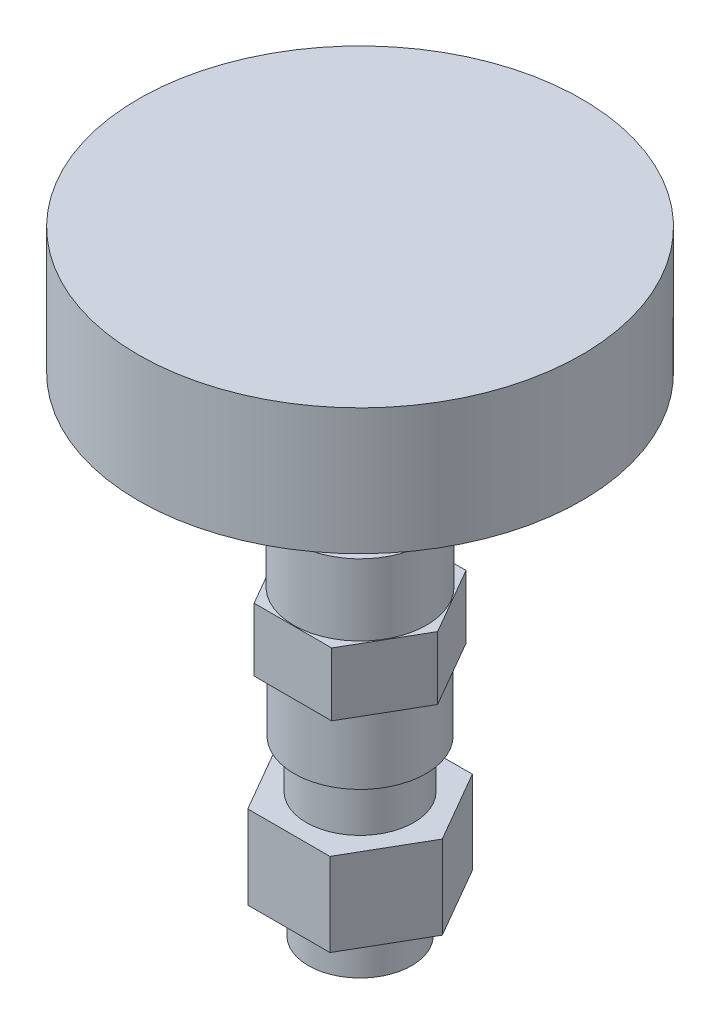
ISO-10303-21;
HEADER;
FILE_DESCRIPTION(('STEP AP214'),'2;1');
FILE_NAME('part.step','',(''),(''),'','','');
FILE_SCHEMA(('AUTOMOTIVE_DESIGN { 1 0 10303 214 1 1 1 1 }'));
ENDSEC;
DATA;
#1=APPLICATION_CONTEXT('core data for automotive mechanical design processes');
#2=APPLICATION_PROTOCOL_DEFINITION('international standard','automotive_design',2000,#1);
#3=PRODUCT_CONTEXT('',#1,'mechanical');
#4=PRODUCT('Part','Part','',(#3));
#5=PRODUCT_RELATED_PRODUCT_CATEGORY('part','',(#4));
#6=PRODUCT_DEFINITION_FORMATION('','',#4);
#7=PRODUCT_DEFINITION_CONTEXT('part definition',#1,'design');
#8=PRODUCT_DEFINITION('design','',#6,#7);
#9=PRODUCT_DEFINITION_SHAPE('','',#8);
#10=(LENGTH_UNIT() NAMED_UNIT(*) SI_UNIT(.MILLI.,.METRE.));
#11=(NAMED_UNIT(*) PLANE_ANGLE_UNIT() SI_UNIT($,.RADIAN.));
#12=(NAMED_UNIT(*) SI_UNIT($,.STERADIAN.) SOLID_ANGLE_UNIT());
#13=UNCERTAINTY_MEASURE_WITH_UNIT(LENGTH_MEASURE(1.E-05),#10,'distance_accuracy_value','');
#14=(GEOMETRIC_REPRESENTATION_CONTEXT(3) GLOBAL_UNCERTAINTY_ASSIGNED_CONTEXT((#13)) GLOBAL_UNIT_ASSIGNED_CONTEXT((#10,
#11,#12)) REPRESENTATION_CONTEXT('',''));
#15=CARTESIAN_POINT('',(0.,0.,0.));
#16=DIRECTION('',(0.,0.,1.));
#17=DIRECTION('',(1.,0.,0.));
#18=AXIS2_PLACEMENT_3D('',#15,#16,#17);
#19=CARTESIAN_POINT('',(0.,35.306,0.));
#20=DIRECTION('',(0.,1.,0.));
#21=DIRECTION('',(0.,0.,1.));
#22=AXIS2_PLACEMENT_3D('',#19,#20,#21);
#23=PLANE('',#22);
#24=CARTESIAN_POINT('',(0.,35.306,0.));
#25=DIRECTION('',(0.,1.,0.));
#26=DIRECTION('',(0.,0.,1.));
#27=AXIS2_PLACEMENT_3D('',#24,#25,#26);
#28=CIRCLE('',#27,6.2865);
#29=CARTESIAN_POINT('',(0.,35.306,6.2865));
#30=VERTEX_POINT('',#29);
#31=EDGE_CURVE('E295',#30,#30,#28,.T.);
#32=ORIENTED_EDGE('',*,*,#31,.T.);
#33=EDGE_LOOP('',(#32));
#34=FACE_BOUND('',#33,.T.);
#35=CARTESIAN_POINT('',(0.,35.306,0.));
#36=DIRECTION('',(0.,1.,0.));
#37=DIRECTION('',(0.,0.,1.));
#38=AXIS2_PLACEMENT_3D('',#35,#36,#37);
#39=CIRCLE('',#38,5.2705);
#40=CARTESIAN_POINT('',(0.,35.306,5.2705));
#41=VERTEX_POINT('',#40);
#42=EDGE_CURVE('E317',#41,#41,#39,.T.);
#43=ORIENTED_EDGE('',*,*,#42,.F.);
#44=EDGE_LOOP('',(#43));
#45=FACE_BOUND('',#44,.T.);
#46=ADVANCED_FACE('F32',(#34,#45),#23,.T.);
#47=CARTESIAN_POINT('',(0.,28.575,0.));
#48=DIRECTION('',(0.,1.,0.));
#49=DIRECTION('',(0.,0.,1.));
#50=AXIS2_PLACEMENT_3D('',#47,#48,#49);
#51=PLANE('',#50);
#52=DIRECTION('',(0.5,0.,-0.866025403784439));
#53=VECTOR('',#52,1.);
#54=CARTESIAN_POINT('',(3.66617420935413,28.575,6.35));
#55=LINE('',#54,#53);
#56=CARTESIAN_POINT('',(3.66617420935413,28.575,6.35));
#57=VERTEX_POINT('',#56);
#58=CARTESIAN_POINT('',(7.33234841870825,28.575,0.));
#59=VERTEX_POINT('',#58);
#60=EDGE_CURVE('E279',#57,#59,#55,.T.);
#61=ORIENTED_EDGE('',*,*,#60,.T.);
#62=DIRECTION('',(-0.5,0.,-0.866025403784439));
#63=VECTOR('',#62,1.);
#64=CARTESIAN_POINT('',(7.33234841870825,28.575,0.));
#65=LINE('',#64,#63);
#66=CARTESIAN_POINT('',(3.66617420935413,28.575,-6.35));
#67=VERTEX_POINT('',#66);
#68=EDGE_CURVE('E307',#59,#67,#65,.T.);
#69=ORIENTED_EDGE('',*,*,#68,.T.);
#70=DIRECTION('',(-1.,0.,0.));
#71=VECTOR('',#70,1.);
#72=CARTESIAN_POINT('',(3.66617420935413,28.575,-6.35));
#73=LINE('',#72,#71);
#74=CARTESIAN_POINT('',(-3.66617420935413,28.575,-6.35));
#75=VERTEX_POINT('',#74);
#76=EDGE_CURVE('E304',#67,#75,#73,.T.);
#77=ORIENTED_EDGE('',*,*,#76,.T.);
#78=DIRECTION('',(-0.5,0.,0.866025403784439));
#79=VECTOR('',#78,1.);
#80=CARTESIAN_POINT('',(-3.66617420935413,28.575,-6.35));
#81=LINE('',#80,#79);
#82=CARTESIAN_POINT('',(-7.33234841870825,28.575,0.));
#83=VERTEX_POINT('',#82);
#84=EDGE_CURVE('E301',#75,#83,#81,.T.);
#85=ORIENTED_EDGE('',*,*,#84,.T.);
#86=DIRECTION('',(0.5,0.,0.866025403784438));
#87=VECTOR('',#86,1.);
#88=CARTESIAN_POINT('',(-7.33234841870825,28.575,0.));
#89=LINE('',#88,#87);
#90=CARTESIAN_POINT('',(-3.66617420935413,28.575,6.35));
#91=VERTEX_POINT('',#90);
#92=EDGE_CURVE('E298',#83,#91,#89,.T.);
#93=ORIENTED_EDGE('',*,*,#92,.T.);
#94=DIRECTION('',(1.,0.,0.));
#95=VECTOR('',#94,1.);
#96=CARTESIAN_POINT('',(-3.66617420935413,28.575,6.35));
#97=LINE('',#96,#95);
#98=EDGE_CURVE('E275',#91,#57,#97,.T.);
#99=ORIENTED_EDGE('',*,*,#98,.T.);
#100=EDGE_LOOP('',(#61,#69,#77,#85,#93,#99));
#101=FACE_BOUND('',#100,.T.);
#102=CARTESIAN_POINT('',(0.,28.575,0.));
#103=DIRECTION('',(0.,1.,0.));
#104=DIRECTION('',(0.,0.,1.));
#105=AXIS2_PLACEMENT_3D('',#102,#103,#104);
#106=CIRCLE('',#105,6.2865);
#107=CARTESIAN_POINT('',(0.,28.575,6.2865));
#108=VERTEX_POINT('',#107);
#109=EDGE_CURVE('E312',#108,#108,#106,.T.);
#110=ORIENTED_EDGE('',*,*,#109,.F.);
#111=EDGE_LOOP('',(#110));
#112=FACE_BOUND('',#111,.T.);
#113=ADVANCED_FACE('F162',(#101,#112),#51,.T.);
#114=CARTESIAN_POINT('',(0.,11.811,0.));
#115=DIRECTION('',(0.,1.,0.));
#116=DIRECTION('',(0.,0.,1.));
#117=AXIS2_PLACEMENT_3D('',#114,#115,#116);
#118=PLANE('',#117);
#119=DIRECTION('',(0.5,0.,-0.866025403784439));
#120=VECTOR('',#119,1.);
#121=CARTESIAN_POINT('',(3.88614466191537,11.811,6.731));
#122=LINE('',#121,#120);
#123=CARTESIAN_POINT('',(3.88614466191537,11.811,6.731));
#124=VERTEX_POINT('',#123);
#125=CARTESIAN_POINT('',(7.77228932383075,11.811,0.));
#126=VERTEX_POINT('',#125);
#127=EDGE_CURVE('E134',#124,#126,#122,.T.);
#128=ORIENTED_EDGE('',*,*,#127,.T.);
#129=DIRECTION('',(-0.5,0.,-0.866025403784438));
#130=VECTOR('',#129,1.);
#131=CARTESIAN_POINT('',(7.77228932383075,11.811,0.));
#132=LINE('',#131,#130);
#133=CARTESIAN_POINT('',(3.88614466191537,11.811,-6.73100000000001));
#134=VERTEX_POINT('',#133);
#135=EDGE_CURVE('E88',#126,#134,#132,.T.);
#136=ORIENTED_EDGE('',*,*,#135,.T.);
#137=DIRECTION('',(-1.,0.,0.));
#138=VECTOR('',#137,1.);
#139=CARTESIAN_POINT('',(3.88614466191537,11.811,-6.73100000000001));
#140=LINE('',#139,#138);
#141=CARTESIAN_POINT('',(-3.88614466191538,11.811,-6.731));
#142=VERTEX_POINT('',#141);
#143=EDGE_CURVE('E105',#134,#142,#140,.T.);
#144=ORIENTED_EDGE('',*,*,#143,.T.);
#145=DIRECTION('',(-0.5,0.,0.866025403784439));
#146=VECTOR('',#145,1.);
#147=CARTESIAN_POINT('',(-3.88614466191538,11.811,-6.731));
#148=LINE('',#147,#146);
#149=CARTESIAN_POINT('',(-7.77228932383075,11.811,0.));
#150=VERTEX_POINT('',#149);
#151=EDGE_CURVE('E98',#142,#150,#148,.T.);
#152=ORIENTED_EDGE('',*,*,#151,.T.);
#153=DIRECTION('',(0.5,0.,0.866025403784438));
#154=VECTOR('',#153,1.);
#155=CARTESIAN_POINT('',(-7.77228932383075,11.811,0.));
#156=LINE('',#155,#154);
#157=CARTESIAN_POINT('',(-3.88614466191537,11.811,6.731));
#158=VERTEX_POINT('',#157);
#159=EDGE_CURVE('E103',#150,#158,#156,.T.);
#160=ORIENTED_EDGE('',*,*,#159,.T.);
#161=DIRECTION('',(1.,0.,0.));
#162=VECTOR('',#161,1.);
#163=CARTESIAN_POINT('',(-3.88614466191537,11.811,6.731));
#164=LINE('',#163,#162);
#165=EDGE_CURVE('E49',#158,#124,#164,.T.);
#166=ORIENTED_EDGE('',*,*,#165,.T.);
#167=EDGE_LOOP('',(#128,#136,#144,#152,#160,#166));
#168=FACE_BOUND('',#167,.T.);
#169=CARTESIAN_POINT('',(0.,11.811,0.));
#170=DIRECTION('',(0.,1.,0.));
#171=DIRECTION('',(0.,0.,1.));
#172=AXIS2_PLACEMENT_3D('',#169,#170,#171);
#173=CIRCLE('',#172,5.08);
#174=CARTESIAN_POINT('',(0.,11.811,5.08));
#175=VERTEX_POINT('',#174);
#176=EDGE_CURVE('E246',#175,#175,#173,.T.);
#177=ORIENTED_EDGE('',*,*,#176,.F.);
#178=EDGE_LOOP('',(#177));
#179=FACE_BOUND('',#178,.T.);
#180=ADVANCED_FACE('F100',(#168,#179),#118,.T.);
#181=CARTESIAN_POINT('',(0.,3.937,0.));
#182=DIRECTION('',(0.,-1.,0.));
#183=DIRECTION('',(0.,0.,-1.));
#184=AXIS2_PLACEMENT_3D('',#181,#182,#183);
#185=CYLINDRICAL_SURFACE('',#184,4.8895);
#186=CARTESIAN_POINT('',(0.,3.937,0.));
#187=DIRECTION('',(0.,1.,0.));
#188=DIRECTION('',(0.,0.,1.));
#189=AXIS2_PLACEMENT_3D('',#186,#187,#188);
#190=CIRCLE('',#189,4.8895);
#191=CARTESIAN_POINT('',(0.,3.937,4.8895));
#192=VERTEX_POINT('',#191);
#193=EDGE_CURVE('E11',#192,#192,#190,.T.);
#194=ORIENTED_EDGE('',*,*,#193,.F.);
#195=EDGE_LOOP('',(#194));
#196=FACE_BOUND('',#195,.T.);
#197=CARTESIAN_POINT('',(0.,0.,0.));
#198=DIRECTION('',(0.,1.,0.));
#199=DIRECTION('',(0.,0.,1.));
#200=AXIS2_PLACEMENT_3D('',#197,#198,#199);
#201=CIRCLE('',#200,4.8895);
#202=CARTESIAN_POINT('',(0.,0.,4.8895));
#203=VERTEX_POINT('',#202);
#204=EDGE_CURVE('E36',#203,#203,#201,.T.);
#205=ORIENTED_EDGE('',*,*,#204,.T.);
#206=EDGE_LOOP('',(#205));
#207=FACE_BOUND('',#206,.T.);
#208=ADVANCED_FACE('F34',(#196,#207),#185,.T.);
#209=CARTESIAN_POINT('',(0.,0.,0.));
#210=DIRECTION('',(0.,1.,0.));
#211=DIRECTION('',(0.,0.,1.));
#212=AXIS2_PLACEMENT_3D('',#209,#210,#211);
#213=PLANE('',#212);
#214=CARTESIAN_POINT('',(0.,0.,0.));
#215=DIRECTION('',(0.,-1.,0.));
#216=DIRECTION('',(0.,0.,-1.));
#217=AXIS2_PLACEMENT_3D('',#214,#215,#216);
#218=CIRCLE('',#217,3.18135);
#219=CARTESIAN_POINT('',(0.,0.,-3.18135));
#220=VERTEX_POINT('',#219);
#221=EDGE_CURVE('E365',#220,#220,#218,.T.);
#222=ORIENTED_EDGE('',*,*,#221,.F.);
#223=EDGE_LOOP('',(#222));
#224=FACE_BOUND('',#223,.T.);
#225=ORIENTED_EDGE('',*,*,#204,.F.);
#226=EDGE_LOOP('',(#225));
#227=FACE_BOUND('',#226,.T.);
#228=ADVANCED_FACE('F147',(#224,#227),#213,.F.);
#229=CARTESIAN_POINT('',(0.,3.937,0.));
#230=DIRECTION('',(0.,1.,0.));
#231=DIRECTION('',(0.,0.,1.));
#232=AXIS2_PLACEMENT_3D('',#229,#230,#231);
#233=PLANE('',#232);
#234=DIRECTION('',(0.5,0.,-0.866025403784439));
#235=VECTOR('',#234,1.);
#236=CARTESIAN_POINT('',(3.88614466191537,3.937,6.731));
#237=LINE('',#236,#235);
#238=CARTESIAN_POINT('',(3.88614466191537,3.937,6.731));
#239=VERTEX_POINT('',#238);
#240=CARTESIAN_POINT('',(7.77228932383075,3.937,0.));
#241=VERTEX_POINT('',#240);
#242=EDGE_CURVE('E123',#239,#241,#237,.T.);
#243=ORIENTED_EDGE('',*,*,#242,.F.);
#244=DIRECTION('',(1.,0.,0.));
#245=VECTOR('',#244,1.);
#246=CARTESIAN_POINT('',(-3.88614466191537,3.937,6.731));
#247=LINE('',#246,#245);
#248=CARTESIAN_POINT('',(-3.88614466191537,3.937,6.731));
#249=VERTEX_POINT('',#248);
#250=EDGE_CURVE('E79',#249,#239,#247,.T.);
#251=ORIENTED_EDGE('',*,*,#250,.F.);
#252=DIRECTION('',(0.5,0.,0.866025403784438));
#253=VECTOR('',#252,1.);
#254=CARTESIAN_POINT('',(-7.77228932383075,3.937,0.));
#255=LINE('',#254,#253);
#256=CARTESIAN_POINT('',(-7.77228932383075,3.937,0.));
#257=VERTEX_POINT('',#256);
#258=EDGE_CURVE('E73',#257,#249,#255,.T.);
#259=ORIENTED_EDGE('',*,*,#258,.F.);
#260=DIRECTION('',(-0.5,0.,0.866025403784439));
#261=VECTOR('',#260,1.);
#262=CARTESIAN_POINT('',(-3.88614466191538,3.937,-6.731));
#263=LINE('',#262,#261);
#264=CARTESIAN_POINT('',(-3.88614466191538,3.937,-6.731));
#265=VERTEX_POINT('',#264);
#266=EDGE_CURVE('E113',#265,#257,#263,.T.);
#267=ORIENTED_EDGE('',*,*,#266,.F.);
#268=DIRECTION('',(-1.,0.,0.));
#269=VECTOR('',#268,1.);
#270=CARTESIAN_POINT('',(3.88614466191537,3.937,-6.73100000000001));
#271=LINE('',#270,#269);
#272=CARTESIAN_POINT('',(3.88614466191537,3.937,-6.73100000000001));
#273=VERTEX_POINT('',#272);
#274=EDGE_CURVE('E129',#273,#265,#271,.T.);
#275=ORIENTED_EDGE('',*,*,#274,.F.);
#276=DIRECTION('',(-0.5,0.,-0.866025403784438));
#277=VECTOR('',#276,1.);
#278=CARTESIAN_POINT('',(7.77228932383075,3.937,0.));
#279=LINE('',#278,#277);
#280=EDGE_CURVE('E126',#241,#273,#279,.T.);
#281=ORIENTED_EDGE('',*,*,#280,.F.);
#282=EDGE_LOOP('',(#243,#251,#259,#267,#275,#281));
#283=FACE_BOUND('',#282,.T.);
#284=ORIENTED_EDGE('',*,*,#193,.T.);
#285=EDGE_LOOP('',(#284));
#286=FACE_BOUND('',#285,.T.);
#287=ADVANCED_FACE('F149',(#283,#286),#233,.F.);
#288=CARTESIAN_POINT('',(3.88614466191537,11.811,6.731));
#289=DIRECTION('',(-0.866025403784439,0.,-0.5));
#290=DIRECTION('',(-0.5,0.,0.866025403784439));
#291=AXIS2_PLACEMENT_3D('',#288,#289,#290);
#292=PLANE('',#291);
#293=ORIENTED_EDGE('',*,*,#242,.T.);
#294=DIRECTION('',(0.,-1.,0.));
#295=VECTOR('',#294,1.);
#296=CARTESIAN_POINT('',(7.77228932383075,11.811,0.));
#297=LINE('',#296,#295);
#298=EDGE_CURVE('E141',#126,#241,#297,.T.);
#299=ORIENTED_EDGE('',*,*,#298,.F.);
#300=ORIENTED_EDGE('',*,*,#127,.F.);
#301=DIRECTION('',(0.,-1.,0.));
#302=VECTOR('',#301,1.);
#303=CARTESIAN_POINT('',(3.88614466191537,11.811,6.731));
#304=LINE('',#303,#302);
#305=EDGE_CURVE('E119',#124,#239,#304,.T.);
#306=ORIENTED_EDGE('',*,*,#305,.T.);
#307=EDGE_LOOP('',(#293,#299,#300,#306));
#308=FACE_BOUND('',#307,.T.);
#309=ADVANCED_FACE('F155',(#308),#292,.F.);
#310=CARTESIAN_POINT('',(7.77228932383075,11.811,0.));
#311=DIRECTION('',(-0.866025403784439,0.,0.5));
#312=DIRECTION('',(0.5,0.,0.866025403784439));
#313=AXIS2_PLACEMENT_3D('',#310,#311,#312);
#314=PLANE('',#313);
#315=ORIENTED_EDGE('',*,*,#280,.T.);
#316=DIRECTION('',(0.,-1.,0.));
#317=VECTOR('',#316,1.);
#318=CARTESIAN_POINT('',(3.88614466191537,11.811,-6.73100000000001));
#319=LINE('',#318,#317);
#320=EDGE_CURVE('E138',#134,#273,#319,.T.);
#321=ORIENTED_EDGE('',*,*,#320,.F.);
#322=ORIENTED_EDGE('',*,*,#135,.F.);
#323=ORIENTED_EDGE('',*,*,#298,.T.);
#324=EDGE_LOOP('',(#315,#321,#322,#323));
#325=FACE_BOUND('',#324,.T.);
#326=ADVANCED_FACE('F232',(#325),#314,.F.);
#327=CARTESIAN_POINT('',(3.88614466191537,11.811,-6.73100000000001));
#328=DIRECTION('',(0.,0.,1.));
#329=DIRECTION('',(1.,0.,0.));
#330=AXIS2_PLACEMENT_3D('',#327,#328,#329);
#331=PLANE('',#330);
#332=ORIENTED_EDGE('',*,*,#274,.T.);
#333=DIRECTION('',(0.,-1.,0.));
#334=VECTOR('',#333,1.);
#335=CARTESIAN_POINT('',(-3.88614466191538,11.811,-6.731));
#336=LINE('',#335,#334);
#337=EDGE_CURVE('E114',#142,#265,#336,.T.);
#338=ORIENTED_EDGE('',*,*,#337,.F.);
#339=ORIENTED_EDGE('',*,*,#143,.F.);
#340=ORIENTED_EDGE('',*,*,#320,.T.);
#341=EDGE_LOOP('',(#332,#338,#339,#340));
#342=FACE_BOUND('',#341,.T.);
#343=ADVANCED_FACE('F229',(#342),#331,.F.);
#344=CARTESIAN_POINT('',(-3.88614466191538,11.811,-6.731));
#345=DIRECTION('',(0.866025403784439,0.,0.5));
#346=DIRECTION('',(0.5,0.,-0.866025403784439));
#347=AXIS2_PLACEMENT_3D('',#344,#345,#346);
#348=PLANE('',#347);
#349=ORIENTED_EDGE('',*,*,#266,.T.);
#350=DIRECTION('',(0.,-1.,0.));
#351=VECTOR('',#350,1.);
#352=CARTESIAN_POINT('',(-7.77228932383075,11.811,0.));
#353=LINE('',#352,#351);
#354=EDGE_CURVE('E110',#150,#257,#353,.T.);
#355=ORIENTED_EDGE('',*,*,#354,.F.);
#356=ORIENTED_EDGE('',*,*,#151,.F.);
#357=ORIENTED_EDGE('',*,*,#337,.T.);
#358=EDGE_LOOP('',(#349,#355,#356,#357));
#359=FACE_BOUND('',#358,.T.);
#360=ADVANCED_FACE('F111',(#359),#348,.F.);
#361=CARTESIAN_POINT('',(-7.77228932383075,11.811,0.));
#362=DIRECTION('',(0.866025403784439,0.,-0.5));
#363=DIRECTION('',(-0.5,0.,-0.866025403784439));
#364=AXIS2_PLACEMENT_3D('',#361,#362,#363);
#365=PLANE('',#364);
#366=ORIENTED_EDGE('',*,*,#258,.T.);
#367=DIRECTION('',(0.,-1.,0.));
#368=VECTOR('',#367,1.);
#369=CARTESIAN_POINT('',(-3.88614466191537,11.811,6.731));
#370=LINE('',#369,#368);
#371=EDGE_CURVE('E115',#158,#249,#370,.T.);
#372=ORIENTED_EDGE('',*,*,#371,.F.);
#373=ORIENTED_EDGE('',*,*,#159,.F.);
#374=ORIENTED_EDGE('',*,*,#354,.T.);
#375=EDGE_LOOP('',(#366,#372,#373,#374));
#376=FACE_BOUND('',#375,.T.);
#377=ADVANCED_FACE('F117',(#376),#365,.F.);
#378=CARTESIAN_POINT('',(-3.88614466191537,11.811,6.731));
#379=DIRECTION('',(0.,0.,-1.));
#380=DIRECTION('',(-1.,0.,0.));
#381=AXIS2_PLACEMENT_3D('',#378,#379,#380);
#382=PLANE('',#381);
#383=ORIENTED_EDGE('',*,*,#250,.T.);
#384=ORIENTED_EDGE('',*,*,#305,.F.);
#385=ORIENTED_EDGE('',*,*,#165,.F.);
#386=ORIENTED_EDGE('',*,*,#371,.T.);
#387=EDGE_LOOP('',(#383,#384,#385,#386));
#388=FACE_BOUND('',#387,.T.);
#389=ADVANCED_FACE('F219',(#388),#382,.F.);
#390=CARTESIAN_POINT('',(0.,16.383,0.));
#391=DIRECTION('',(0.,-1.,0.));
#392=DIRECTION('',(0.,0.,-1.));
#393=AXIS2_PLACEMENT_3D('',#390,#391,#392);
#394=CYLINDRICAL_SURFACE('',#393,5.08);
#395=CARTESIAN_POINT('',(0.,16.383,0.));
#396=DIRECTION('',(0.,1.,0.));
#397=DIRECTION('',(0.,0.,1.));
#398=AXIS2_PLACEMENT_3D('',#395,#396,#397);
#399=CIRCLE('',#398,5.08);
#400=CARTESIAN_POINT('',(0.,16.383,5.08));
#401=VERTEX_POINT('',#400);
#402=EDGE_CURVE('E127',#401,#401,#399,.T.);
#403=ORIENTED_EDGE('',*,*,#402,.F.);
#404=EDGE_LOOP('',(#403));
#405=FACE_BOUND('',#404,.T.);
#406=ORIENTED_EDGE('',*,*,#176,.T.);
#407=EDGE_LOOP('',(#406));
#408=FACE_BOUND('',#407,.T.);
#409=ADVANCED_FACE('F212',(#405,#408),#394,.T.);
#410=CARTESIAN_POINT('',(0.,16.383,0.));
#411=DIRECTION('',(0.,1.,0.));
#412=DIRECTION('',(0.,0.,1.));
#413=AXIS2_PLACEMENT_3D('',#410,#411,#412);
#414=PLANE('',#413);
#415=CARTESIAN_POINT('',(0.,16.383,0.));
#416=DIRECTION('',(0.,1.,0.));
#417=DIRECTION('',(0.,0.,1.));
#418=AXIS2_PLACEMENT_3D('',#415,#416,#417);
#419=CIRCLE('',#418,6.223);
#420=CARTESIAN_POINT('',(0.,16.383,6.223));
#421=VERTEX_POINT('',#420);
#422=EDGE_CURVE('E252',#421,#421,#419,.T.);
#423=ORIENTED_EDGE('',*,*,#422,.F.);
#424=EDGE_LOOP('',(#423));
#425=FACE_BOUND('',#424,.T.);
#426=ORIENTED_EDGE('',*,*,#402,.T.);
#427=EDGE_LOOP('',(#426));
#428=FACE_BOUND('',#427,.T.);
#429=ADVANCED_FACE('F209',(#425,#428),#414,.F.);
#430=CARTESIAN_POINT('',(0.,22.606,0.));
#431=DIRECTION('',(0.,-1.,0.));
#432=DIRECTION('',(0.,0.,-1.));
#433=AXIS2_PLACEMENT_3D('',#430,#431,#432);
#434=CYLINDRICAL_SURFACE('',#433,6.223);
#435=CARTESIAN_POINT('',(0.,22.606,0.));
#436=DIRECTION('',(0.,1.,0.));
#437=DIRECTION('',(0.,0.,1.));
#438=AXIS2_PLACEMENT_3D('',#435,#436,#437);
#439=CIRCLE('',#438,6.223);
#440=CARTESIAN_POINT('',(0.,22.606,6.223));
#441=VERTEX_POINT('',#440);
#442=EDGE_CURVE('E249',#441,#441,#439,.T.);
#443=ORIENTED_EDGE('',*,*,#442,.F.);
#444=EDGE_LOOP('',(#443));
#445=FACE_BOUND('',#444,.T.);
#446=ORIENTED_EDGE('',*,*,#422,.T.);
#447=EDGE_LOOP('',(#446));
#448=FACE_BOUND('',#447,.T.);
#449=ADVANCED_FACE('F185',(#445,#448),#434,.T.);
#450=CARTESIAN_POINT('',(0.,22.606,0.));
#451=DIRECTION('',(0.,1.,0.));
#452=DIRECTION('',(0.,0.,1.));
#453=AXIS2_PLACEMENT_3D('',#450,#451,#452);
#454=PLANE('',#453);
#455=DIRECTION('',(0.5,0.,-0.866025403784439));
#456=VECTOR('',#455,1.);
#457=CARTESIAN_POINT('',(3.66617420935413,22.606,6.35));
#458=LINE('',#457,#456);
#459=CARTESIAN_POINT('',(3.66617420935413,22.606,6.35));
#460=VERTEX_POINT('',#459);
#461=CARTESIAN_POINT('',(7.33234841870825,22.606,0.));
#462=VERTEX_POINT('',#461);
#463=EDGE_CURVE('E292',#460,#462,#458,.T.);
#464=ORIENTED_EDGE('',*,*,#463,.F.);
#465=DIRECTION('',(1.,0.,0.));
#466=VECTOR('',#465,1.);
#467=CARTESIAN_POINT('',(-3.66617420935413,22.606,6.35));
#468=LINE('',#467,#466);
#469=CARTESIAN_POINT('',(-3.66617420935413,22.606,6.35));
#470=VERTEX_POINT('',#469);
#471=EDGE_CURVE('E276',#470,#460,#468,.T.);
#472=ORIENTED_EDGE('',*,*,#471,.F.);
#473=DIRECTION('',(0.5,0.,0.866025403784438));
#474=VECTOR('',#473,1.);
#475=CARTESIAN_POINT('',(-7.33234841870825,22.606,0.));
#476=LINE('',#475,#474);
#477=CARTESIAN_POINT('',(-7.33234841870825,22.606,0.));
#478=VERTEX_POINT('',#477);
#479=EDGE_CURVE('E280',#478,#470,#476,.T.);
#480=ORIENTED_EDGE('',*,*,#479,.F.);
#481=DIRECTION('',(-0.5,0.,0.866025403784439));
#482=VECTOR('',#481,1.);
#483=CARTESIAN_POINT('',(-3.66617420935413,22.606,-6.35));
#484=LINE('',#483,#482);
#485=CARTESIAN_POINT('',(-3.66617420935413,22.606,-6.35));
#486=VERTEX_POINT('',#485);
#487=EDGE_CURVE('E283',#486,#478,#484,.T.);
#488=ORIENTED_EDGE('',*,*,#487,.F.);
#489=DIRECTION('',(-1.,0.,0.));
#490=VECTOR('',#489,1.);
#491=CARTESIAN_POINT('',(3.66617420935413,22.606,-6.35));
#492=LINE('',#491,#490);
#493=CARTESIAN_POINT('',(3.66617420935413,22.606,-6.35));
#494=VERTEX_POINT('',#493);
#495=EDGE_CURVE('E286',#494,#486,#492,.T.);
#496=ORIENTED_EDGE('',*,*,#495,.F.);
#497=DIRECTION('',(-0.5,0.,-0.866025403784439));
#498=VECTOR('',#497,1.);
#499=CARTESIAN_POINT('',(7.33234841870825,22.606,0.));
#500=LINE('',#499,#498);
#501=EDGE_CURVE('E289',#462,#494,#500,.T.);
#502=ORIENTED_EDGE('',*,*,#501,.F.);
#503=EDGE_LOOP('',(#464,#472,#480,#488,#496,#502));
#504=FACE_BOUND('',#503,.T.);
#505=ORIENTED_EDGE('',*,*,#442,.T.);
#506=EDGE_LOOP('',(#505));
#507=FACE_BOUND('',#506,.T.);
#508=ADVANCED_FACE('F181',(#504,#507),#454,.F.);
#509=CARTESIAN_POINT('',(3.66617420935413,28.575,6.35));
#510=DIRECTION('',(-0.866025403784439,0.,-0.5));
#511=DIRECTION('',(-0.5,0.,0.866025403784439));
#512=AXIS2_PLACEMENT_3D('',#509,#510,#511);
#513=PLANE('',#512);
#514=ORIENTED_EDGE('',*,*,#463,.T.);
#515=DIRECTION('',(0.,-1.,0.));
#516=VECTOR('',#515,1.);
#517=CARTESIAN_POINT('',(7.33234841870825,28.575,0.));
#518=LINE('',#517,#516);
#519=EDGE_CURVE('E255',#59,#462,#518,.T.);
#520=ORIENTED_EDGE('',*,*,#519,.F.);
#521=ORIENTED_EDGE('',*,*,#60,.F.);
#522=DIRECTION('',(0.,-1.,0.));
#523=VECTOR('',#522,1.);
#524=CARTESIAN_POINT('',(3.66617420935413,28.575,6.35));
#525=LINE('',#524,#523);
#526=EDGE_CURVE('E272',#57,#460,#525,.T.);
#527=ORIENTED_EDGE('',*,*,#526,.T.);
#528=EDGE_LOOP('',(#514,#520,#521,#527));
#529=FACE_BOUND('',#528,.T.);
#530=ADVANCED_FACE('F184',(#529),#513,.F.);
#531=CARTESIAN_POINT('',(7.33234841870825,28.575,0.));
#532=DIRECTION('',(-0.866025403784439,0.,0.5));
#533=DIRECTION('',(0.5,0.,0.866025403784439));
#534=AXIS2_PLACEMENT_3D('',#531,#532,#533);
#535=PLANE('',#534);
#536=ORIENTED_EDGE('',*,*,#501,.T.);
#537=DIRECTION('',(0.,-1.,0.));
#538=VECTOR('',#537,1.);
#539=CARTESIAN_POINT('',(3.66617420935413,28.575,-6.35));
#540=LINE('',#539,#538);
#541=EDGE_CURVE('E260',#67,#494,#540,.T.);
#542=ORIENTED_EDGE('',*,*,#541,.F.);
#543=ORIENTED_EDGE('',*,*,#68,.F.);
#544=ORIENTED_EDGE('',*,*,#519,.T.);
#545=EDGE_LOOP('',(#536,#542,#543,#544));
#546=FACE_BOUND('',#545,.T.);
#547=ADVANCED_FACE('F201',(#546),#535,.F.);
#548=CARTESIAN_POINT('',(3.66617420935413,28.575,-6.35));
#549=DIRECTION('',(0.,0.,1.));
#550=DIRECTION('',(1.,0.,0.));
#551=AXIS2_PLACEMENT_3D('',#548,#549,#550);
#552=PLANE('',#551);
#553=ORIENTED_EDGE('',*,*,#495,.T.);
#554=DIRECTION('',(0.,-1.,0.));
#555=VECTOR('',#554,1.);
#556=CARTESIAN_POINT('',(-3.66617420935413,28.575,-6.35));
#557=LINE('',#556,#555);
#558=EDGE_CURVE('E263',#75,#486,#557,.T.);
#559=ORIENTED_EDGE('',*,*,#558,.F.);
#560=ORIENTED_EDGE('',*,*,#76,.F.);
#561=ORIENTED_EDGE('',*,*,#541,.T.);
#562=EDGE_LOOP('',(#553,#559,#560,#561));
#563=FACE_BOUND('',#562,.T.);
#564=ADVANCED_FACE('F197',(#563),#552,.F.);
#565=CARTESIAN_POINT('',(-3.66617420935413,28.575,-6.35));
#566=DIRECTION('',(0.866025403784439,0.,0.5));
#567=DIRECTION('',(0.5,0.,-0.866025403784439));
#568=AXIS2_PLACEMENT_3D('',#565,#566,#567);
#569=PLANE('',#568);
#570=ORIENTED_EDGE('',*,*,#487,.T.);
#571=DIRECTION('',(0.,-1.,0.));
#572=VECTOR('',#571,1.);
#573=CARTESIAN_POINT('',(-7.33234841870825,28.575,0.));
#574=LINE('',#573,#572);
#575=EDGE_CURVE('E266',#83,#478,#574,.T.);
#576=ORIENTED_EDGE('',*,*,#575,.F.);
#577=ORIENTED_EDGE('',*,*,#84,.F.);
#578=ORIENTED_EDGE('',*,*,#558,.T.);
#579=EDGE_LOOP('',(#570,#576,#577,#578));
#580=FACE_BOUND('',#579,.T.);
#581=ADVANCED_FACE('F193',(#580),#569,.F.);
#582=CARTESIAN_POINT('',(-7.33234841870825,28.575,0.));
#583=DIRECTION('',(0.866025403784439,0.,-0.5));
#584=DIRECTION('',(-0.5,0.,-0.866025403784439));
#585=AXIS2_PLACEMENT_3D('',#582,#583,#584);
#586=PLANE('',#585);
#587=ORIENTED_EDGE('',*,*,#479,.T.);
#588=DIRECTION('',(0.,-1.,0.));
#589=VECTOR('',#588,1.);
#590=CARTESIAN_POINT('',(-3.66617420935413,28.575,6.35));
#591=LINE('',#590,#589);
#592=EDGE_CURVE('E269',#91,#470,#591,.T.);
#593=ORIENTED_EDGE('',*,*,#592,.F.);
#594=ORIENTED_EDGE('',*,*,#92,.F.);
#595=ORIENTED_EDGE('',*,*,#575,.T.);
#596=EDGE_LOOP('',(#587,#593,#594,#595));
#597=FACE_BOUND('',#596,.T.);
#598=ADVANCED_FACE('F189',(#597),#586,.F.);
#599=CARTESIAN_POINT('',(-3.66617420935413,28.575,6.35));
#600=DIRECTION('',(0.,0.,-1.));
#601=DIRECTION('',(-1.,0.,0.));
#602=AXIS2_PLACEMENT_3D('',#599,#600,#601);
#603=PLANE('',#602);
#604=ORIENTED_EDGE('',*,*,#471,.T.);
#605=ORIENTED_EDGE('',*,*,#526,.F.);
#606=ORIENTED_EDGE('',*,*,#98,.F.);
#607=ORIENTED_EDGE('',*,*,#592,.T.);
#608=EDGE_LOOP('',(#604,#605,#606,#607));
#609=FACE_BOUND('',#608,.T.);
#610=ADVANCED_FACE('F178',(#609),#603,.F.);
#611=CARTESIAN_POINT('',(0.,35.306,0.));
#612=DIRECTION('',(0.,-1.,0.));
#613=DIRECTION('',(0.,0.,-1.));
#614=AXIS2_PLACEMENT_3D('',#611,#612,#613);
#615=CYLINDRICAL_SURFACE('',#614,6.2865);
#616=ORIENTED_EDGE('',*,*,#31,.F.);
#617=EDGE_LOOP('',(#616));
#618=FACE_BOUND('',#617,.T.);
#619=ORIENTED_EDGE('',*,*,#109,.T.);
#620=EDGE_LOOP('',(#619));
#621=FACE_BOUND('',#620,.T.);
#622=ADVANCED_FACE('F176',(#618,#621),#615,.T.);
#623=CARTESIAN_POINT('',(0.,39.624,0.));
#624=DIRECTION('',(0.,-1.,0.));
#625=DIRECTION('',(0.,0.,-1.));
#626=AXIS2_PLACEMENT_3D('',#623,#624,#625);
#627=CYLINDRICAL_SURFACE('',#626,5.2705);
#628=CARTESIAN_POINT('',(0.,39.624,0.));
#629=DIRECTION('',(0.,1.,0.));
#630=DIRECTION('',(0.,0.,1.));
#631=AXIS2_PLACEMENT_3D('',#628,#629,#630);
#632=CIRCLE('',#631,5.2705);
#633=CARTESIAN_POINT('',(0.,39.624,5.2705));
#634=VERTEX_POINT('',#633);
#635=EDGE_CURVE('E315',#634,#634,#632,.T.);
#636=ORIENTED_EDGE('',*,*,#635,.F.);
#637=EDGE_LOOP('',(#636));
#638=FACE_BOUND('',#637,.T.);
#639=ORIENTED_EDGE('',*,*,#42,.T.);
#640=EDGE_LOOP('',(#639));
#641=FACE_BOUND('',#640,.T.);
#642=ADVANCED_FACE('F174',(#638,#641),#627,.T.);
#643=CARTESIAN_POINT('',(0.,39.624,0.));
#644=DIRECTION('',(0.,-1.,0.));
#645=DIRECTION('',(0.,0.,-1.));
#646=AXIS2_PLACEMENT_3D('',#643,#644,#645);
#647=PLANE('',#646);
#648=DIRECTION('',(0.,0.,-1.));
#649=VECTOR('',#648,1.);
#650=CARTESIAN_POINT('',(5.461,39.624,5.461));
#651=LINE('',#650,#649);
#652=CARTESIAN_POINT('',(5.461,39.624,5.461));
#653=VERTEX_POINT('',#652);
#654=CARTESIAN_POINT('',(5.461,39.624,-5.461));
#655=VERTEX_POINT('',#654);
#656=EDGE_CURVE('E345',#653,#655,#651,.T.);
#657=ORIENTED_EDGE('',*,*,#656,.F.);
#658=DIRECTION('',(1.,0.,0.));
#659=VECTOR('',#658,1.);
#660=CARTESIAN_POINT('',(-5.461,39.624,5.461));
#661=LINE('',#660,#659);
#662=CARTESIAN_POINT('',(-5.461,39.624,5.461));
#663=VERTEX_POINT('',#662);
#664=EDGE_CURVE('E335',#663,#653,#661,.T.);
#665=ORIENTED_EDGE('',*,*,#664,.F.);
#666=DIRECTION('',(0.,0.,1.));
#667=VECTOR('',#666,1.);
#668=CARTESIAN_POINT('',(-5.461,39.624,5.461));
#669=LINE('',#668,#667);
#670=CARTESIAN_POINT('',(-5.461,39.624,-5.461));
#671=VERTEX_POINT('',#670);
#672=EDGE_CURVE('E339',#671,#663,#669,.T.);
#673=ORIENTED_EDGE('',*,*,#672,.F.);
#674=DIRECTION('',(-1.,0.,0.));
#675=VECTOR('',#674,1.);
#676=CARTESIAN_POINT('',(-5.461,39.624,-5.461));
#677=LINE('',#676,#675);
#678=EDGE_CURVE('E342',#655,#671,#677,.T.);
#679=ORIENTED_EDGE('',*,*,#678,.F.);
#680=EDGE_LOOP('',(#657,#665,#673,#679));
#681=FACE_BOUND('',#680,.T.);
#682=ORIENTED_EDGE('',*,*,#635,.T.);
#683=EDGE_LOOP('',(#682));
#684=FACE_BOUND('',#683,.T.);
#685=ADVANCED_FACE('F395',(#681,#684),#647,.T.);
#686=CARTESIAN_POINT('',(5.461,46.101,5.461));
#687=DIRECTION('',(-1.,0.,0.));
#688=DIRECTION('',(0.,0.,1.));
#689=AXIS2_PLACEMENT_3D('',#686,#687,#688);
#690=PLANE('',#689);
#691=ORIENTED_EDGE('',*,*,#656,.T.);
#692=DIRECTION('',(0.,-1.,0.));
#693=VECTOR('',#692,1.);
#694=CARTESIAN_POINT('',(5.461,46.101,-5.461));
#695=LINE('',#694,#693);
#696=CARTESIAN_POINT('',(5.461,46.101,-5.461));
#697=VERTEX_POINT('',#696);
#698=EDGE_CURVE('E320',#697,#655,#695,.T.);
#699=ORIENTED_EDGE('',*,*,#698,.F.);
#700=DIRECTION('',(0.,0.,-1.));
#701=VECTOR('',#700,1.);
#702=CARTESIAN_POINT('',(5.461,46.101,5.461));
#703=LINE('',#702,#701);
#704=CARTESIAN_POINT('',(5.461,46.101,5.461));
#705=VERTEX_POINT('',#704);
#706=EDGE_CURVE('E338',#705,#697,#703,.T.);
#707=ORIENTED_EDGE('',*,*,#706,.F.);
#708=DIRECTION('',(0.,-1.,0.));
#709=VECTOR('',#708,1.);
#710=CARTESIAN_POINT('',(5.461,46.101,5.461));
#711=LINE('',#710,#709);
#712=EDGE_CURVE('E331',#705,#653,#711,.T.);
#713=ORIENTED_EDGE('',*,*,#712,.T.);
#714=EDGE_LOOP('',(#691,#699,#707,#713));
#715=FACE_BOUND('',#714,.T.);
#716=ADVANCED_FACE('F398',(#715),#690,.F.);
#717=CARTESIAN_POINT('',(-5.461,46.101,-5.461));
#718=DIRECTION('',(0.,0.,1.));
#719=DIRECTION('',(1.,0.,0.));
#720=AXIS2_PLACEMENT_3D('',#717,#718,#719);
#721=PLANE('',#720);
#722=ORIENTED_EDGE('',*,*,#678,.T.);
#723=DIRECTION('',(0.,-1.,0.));
#724=VECTOR('',#723,1.);
#725=CARTESIAN_POINT('',(-5.461,46.101,-5.461));
#726=LINE('',#725,#724);
#727=CARTESIAN_POINT('',(-5.461,46.101,-5.461));
#728=VERTEX_POINT('',#727);
#729=EDGE_CURVE('E325',#728,#671,#726,.T.);
#730=ORIENTED_EDGE('',*,*,#729,.F.);
#731=DIRECTION('',(-1.,0.,0.));
#732=VECTOR('',#731,1.);
#733=CARTESIAN_POINT('',(-5.461,46.101,-5.461));
#734=LINE('',#733,#732);
#735=EDGE_CURVE('E354',#697,#728,#734,.T.);
#736=ORIENTED_EDGE('',*,*,#735,.F.);
#737=ORIENTED_EDGE('',*,*,#698,.T.);
#738=EDGE_LOOP('',(#722,#730,#736,#737));
#739=FACE_BOUND('',#738,.T.);
#740=ADVANCED_FACE('F406',(#739),#721,.F.);
#741=CARTESIAN_POINT('',(-5.461,46.101,5.461));
#742=DIRECTION('',(1.,0.,0.));
#743=DIRECTION('',(0.,0.,-1.));
#744=AXIS2_PLACEMENT_3D('',#741,#742,#743);
#745=PLANE('',#744);
#746=ORIENTED_EDGE('',*,*,#672,.T.);
#747=DIRECTION('',(0.,-1.,0.));
#748=VECTOR('',#747,1.);
#749=CARTESIAN_POINT('',(-5.461,46.101,5.461));
#750=LINE('',#749,#748);
#751=CARTESIAN_POINT('',(-5.461,46.101,5.461));
#752=VERTEX_POINT('',#751);
#753=EDGE_CURVE('E328',#752,#663,#750,.T.);
#754=ORIENTED_EDGE('',*,*,#753,.F.);
#755=DIRECTION('',(0.,0.,1.));
#756=VECTOR('',#755,1.);
#757=CARTESIAN_POINT('',(-5.461,46.101,5.461));
#758=LINE('',#757,#756);
#759=EDGE_CURVE('E351',#728,#752,#758,.T.);
#760=ORIENTED_EDGE('',*,*,#759,.F.);
#761=ORIENTED_EDGE('',*,*,#729,.T.);
#762=EDGE_LOOP('',(#746,#754,#760,#761));
#763=FACE_BOUND('',#762,.T.);
#764=ADVANCED_FACE('F402',(#763),#745,.F.);
#765=CARTESIAN_POINT('',(-5.461,46.101,5.461));
#766=DIRECTION('',(0.,0.,-1.));
#767=DIRECTION('',(-1.,0.,0.));
#768=AXIS2_PLACEMENT_3D('',#765,#766,#767);
#769=PLANE('',#768);
#770=ORIENTED_EDGE('',*,*,#664,.T.);
#771=ORIENTED_EDGE('',*,*,#712,.F.);
#772=DIRECTION('',(1.,0.,0.));
#773=VECTOR('',#772,1.);
#774=CARTESIAN_POINT('',(-5.461,46.101,5.461));
#775=LINE('',#774,#773);
#776=EDGE_CURVE('E334',#752,#705,#775,.T.);
#777=ORIENTED_EDGE('',*,*,#776,.F.);
#778=ORIENTED_EDGE('',*,*,#753,.T.);
#779=EDGE_LOOP('',(#770,#771,#777,#778));
#780=FACE_BOUND('',#779,.T.);
#781=ADVANCED_FACE('F390',(#780),#769,.F.);
#782=CARTESIAN_POINT('',(0.,46.101,0.));
#783=DIRECTION('',(0.,1.,0.));
#784=DIRECTION('',(0.,0.,1.));
#785=AXIS2_PLACEMENT_3D('',#782,#783,#784);
#786=PLANE('',#785);
#787=CARTESIAN_POINT('',(0.,46.101,0.));
#788=DIRECTION('',(0.,1.,0.));
#789=DIRECTION('',(0.,0.,1.));
#790=AXIS2_PLACEMENT_3D('',#787,#788,#789);
#791=CIRCLE('',#790,20.955);
#792=CARTESIAN_POINT('',(0.,46.101,20.955));
#793=VERTEX_POINT('',#792);
#794=EDGE_CURVE('E359',#793,#793,#791,.T.);
#795=ORIENTED_EDGE('',*,*,#794,.F.);
#796=EDGE_LOOP('',(#795));
#797=FACE_BOUND('',#796,.T.);
#798=ORIENTED_EDGE('',*,*,#776,.T.);
#799=ORIENTED_EDGE('',*,*,#706,.T.);
#800=ORIENTED_EDGE('',*,*,#735,.T.);
#801=ORIENTED_EDGE('',*,*,#759,.T.);
#802=EDGE_LOOP('',(#798,#799,#800,#801));
#803=FACE_BOUND('',#802,.T.);
#804=ADVANCED_FACE('F387',(#797,#803),#786,.F.);
#805=CARTESIAN_POINT('',(0.,58.039,0.));
#806=DIRECTION('',(0.,-1.,0.));
#807=DIRECTION('',(0.,0.,-1.));
#808=AXIS2_PLACEMENT_3D('',#805,#806,#807);
#809=CYLINDRICAL_SURFACE('',#808,20.955);
#810=CARTESIAN_POINT('',(0.,58.039,0.));
#811=DIRECTION('',(0.,1.,0.));
#812=DIRECTION('',(0.,0.,1.));
#813=AXIS2_PLACEMENT_3D('',#810,#811,#812);
#814=CIRCLE('',#813,20.955);
#815=CARTESIAN_POINT('',(0.,58.039,20.955));
#816=VERTEX_POINT('',#815);
#817=EDGE_CURVE('E348',#816,#816,#814,.T.);
#818=ORIENTED_EDGE('',*,*,#817,.F.);
#819=EDGE_LOOP('',(#818));
#820=FACE_BOUND('',#819,.T.);
#821=ORIENTED_EDGE('',*,*,#794,.T.);
#822=EDGE_LOOP('',(#821));
#823=FACE_BOUND('',#822,.T.);
#824=ADVANCED_FACE('F383',(#820,#823),#809,.T.);
#825=CARTESIAN_POINT('',(0.,58.039,0.));
#826=DIRECTION('',(0.,1.,0.));
#827=DIRECTION('',(0.,0.,1.));
#828=AXIS2_PLACEMENT_3D('',#825,#826,#827);
#829=PLANE('',#828);
#830=ORIENTED_EDGE('',*,*,#817,.T.);
#831=EDGE_LOOP('',(#830));
#832=FACE_BOUND('',#831,.T.);
#833=ADVANCED_FACE('F376',(#832),#829,.T.);
#834=CARTESIAN_POINT('',(0.,11.938,0.));
#835=DIRECTION('',(0.,-1.,0.));
#836=DIRECTION('',(0.,0.,-1.));
#837=AXIS2_PLACEMENT_3D('',#834,#835,#836);
#838=CYLINDRICAL_SURFACE('',#837,3.18135);
#839=CARTESIAN_POINT('',(0.,11.938,0.));
#840=DIRECTION('',(0.,-1.,0.));
#841=DIRECTION('',(0.,0.,-1.));
#842=AXIS2_PLACEMENT_3D('',#839,#840,#841);
#843=CIRCLE('',#842,3.18135);
#844=CARTESIAN_POINT('',(0.,11.938,-3.18135));
#845=VERTEX_POINT('',#844);
#846=EDGE_CURVE('E362',#845,#845,#843,.T.);
#847=ORIENTED_EDGE('',*,*,#846,.F.);
#848=EDGE_LOOP('',(#847));
#849=FACE_BOUND('',#848,.T.);
#850=ORIENTED_EDGE('',*,*,#221,.T.);
#851=EDGE_LOOP('',(#850));
#852=FACE_BOUND('',#851,.T.);
#853=ADVANCED_FACE('F373',(#849,#852),#838,.F.);
#854=CARTESIAN_POINT('',(0.,11.938,0.));
#855=DIRECTION('',(0.,-1.,0.));
#856=DIRECTION('',(0.,0.,-1.));
#857=AXIS2_PLACEMENT_3D('',#854,#855,#856);
#858=PLANE('',#857);
#859=ORIENTED_EDGE('',*,*,#846,.T.);
#860=EDGE_LOOP('',(#859));
#861=FACE_BOUND('',#860,.T.);
#862=ADVANCED_FACE('F371',(#861),#858,.T.);
#863=CLOSED_SHELL('',(#46,#113,#180,#208,#228,#287,#309,#326,#343,#360,#377,#389,#409,#429,#449,
#508,#530,#547,#564,#581,#598,#610,#622,#642,#685,#716,#740,#764,#781,#804,#824,#833,#853,#862));
#864=MANIFOLD_SOLID_BREP('B2',#863);
#865=ADVANCED_BREP_SHAPE_REPRESENTATION('',(#18,#864),#14);
#866=SHAPE_DEFINITION_REPRESENTATION(#9,#865);
ENDSEC;
END-ISO-10303-21;
